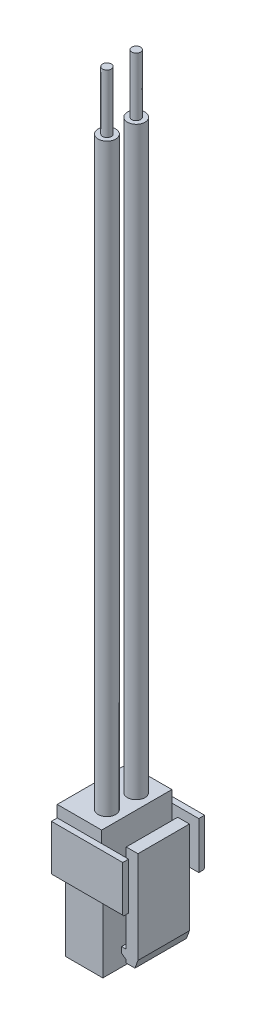
ISO-10303-21;
HEADER;
FILE_DESCRIPTION(('STEP AP214'),'2;1');
FILE_NAME('part.step','',(''),(''),'','','');
FILE_SCHEMA(('AUTOMOTIVE_DESIGN { 1 0 10303 214 1 1 1 1 }'));
ENDSEC;
DATA;
#1=APPLICATION_CONTEXT('core data for automotive mechanical design processes');
#2=APPLICATION_PROTOCOL_DEFINITION('international standard','automotive_design',2000,#1);
#3=PRODUCT_CONTEXT('',#1,'mechanical');
#4=PRODUCT('Part','Part','',(#3));
#5=PRODUCT_RELATED_PRODUCT_CATEGORY('part','',(#4));
#6=PRODUCT_DEFINITION_FORMATION('','',#4);
#7=PRODUCT_DEFINITION_CONTEXT('part definition',#1,'design');
#8=PRODUCT_DEFINITION('design','',#6,#7);
#9=PRODUCT_DEFINITION_SHAPE('','',#8);
#10=(LENGTH_UNIT() NAMED_UNIT(*) SI_UNIT(.MILLI.,.METRE.));
#11=(NAMED_UNIT(*) PLANE_ANGLE_UNIT() SI_UNIT($,.RADIAN.));
#12=(NAMED_UNIT(*) SI_UNIT($,.STERADIAN.) SOLID_ANGLE_UNIT());
#13=UNCERTAINTY_MEASURE_WITH_UNIT(LENGTH_MEASURE(1.E-05),#10,'distance_accuracy_value','');
#14=(GEOMETRIC_REPRESENTATION_CONTEXT(3) GLOBAL_UNCERTAINTY_ASSIGNED_CONTEXT((#13)) GLOBAL_UNIT_ASSIGNED_CONTEXT((#10,
#11,#12)) REPRESENTATION_CONTEXT('',''));
#15=CARTESIAN_POINT('',(0.,0.,0.));
#16=DIRECTION('',(0.,0.,1.));
#17=DIRECTION('',(1.,0.,0.));
#18=AXIS2_PLACEMENT_3D('',#15,#16,#17);
#19=CARTESIAN_POINT('',(1.6,4.,3.));
#20=DIRECTION('',(-1.,0.,0.));
#21=DIRECTION('',(0.,0.,1.));
#22=AXIS2_PLACEMENT_3D('',#19,#20,#21);
#23=PLANE('',#22);
#24=DIRECTION('',(0.,0.,-1.));
#25=VECTOR('',#24,1.);
#26=CARTESIAN_POINT('',(1.6,0.,3.));
#27=LINE('',#26,#25);
#28=CARTESIAN_POINT('',(1.6,0.,3.));
#29=VERTEX_POINT('',#28);
#30=CARTESIAN_POINT('',(1.6,0.,2.9));
#31=VERTEX_POINT('',#30);
#32=EDGE_CURVE('E551',#29,#31,#27,.T.);
#33=ORIENTED_EDGE('',*,*,#32,.T.);
#34=DIRECTION('',(0.,1.,0.));
#35=VECTOR('',#34,1.);
#36=CARTESIAN_POINT('',(1.6,-6.,2.9));
#37=LINE('',#36,#35);
#38=CARTESIAN_POINT('',(1.6,-6.,2.9));
#39=VERTEX_POINT('',#38);
#40=EDGE_CURVE('E558',#39,#31,#37,.T.);
#41=ORIENTED_EDGE('',*,*,#40,.F.);
#42=DIRECTION('',(0.,0.,1.));
#43=VECTOR('',#42,1.);
#44=CARTESIAN_POINT('',(1.6,-6.,-2.9));
#45=LINE('',#44,#43);
#46=CARTESIAN_POINT('',(1.6,-6.,-2.9));
#47=VERTEX_POINT('',#46);
#48=EDGE_CURVE('E267',#47,#39,#45,.T.);
#49=ORIENTED_EDGE('',*,*,#48,.F.);
#50=DIRECTION('',(0.,1.,0.));
#51=VECTOR('',#50,1.);
#52=CARTESIAN_POINT('',(1.6,-6.,-2.9));
#53=LINE('',#52,#51);
#54=CARTESIAN_POINT('',(1.6,0.,-2.9));
#55=VERTEX_POINT('',#54);
#56=EDGE_CURVE('E277',#47,#55,#53,.T.);
#57=ORIENTED_EDGE('',*,*,#56,.T.);
#58=CARTESIAN_POINT('',(1.6,0.,-3.));
#59=VERTEX_POINT('',#58);
#60=EDGE_CURVE('E543',#55,#59,#27,.T.);
#61=ORIENTED_EDGE('',*,*,#60,.T.);
#62=DIRECTION('',(0.,-1.,0.));
#63=VECTOR('',#62,1.);
#64=CARTESIAN_POINT('',(1.6,4.,-3.));
#65=LINE('',#64,#63);
#66=CARTESIAN_POINT('',(1.6,4.,-3.));
#67=VERTEX_POINT('',#66);
#68=EDGE_CURVE('E610',#67,#59,#65,.T.);
#69=ORIENTED_EDGE('',*,*,#68,.F.);
#70=DIRECTION('',(0.,-1.,0.));
#71=VECTOR('',#70,1.);
#72=CARTESIAN_POINT('',(1.6,5.,-3.));
#73=LINE('',#72,#71);
#74=CARTESIAN_POINT('',(1.6,5.,-3.));
#75=VERTEX_POINT('',#74);
#76=EDGE_CURVE('E565',#75,#67,#73,.T.);
#77=ORIENTED_EDGE('',*,*,#76,.F.);
#78=DIRECTION('',(0.,0.,-1.));
#79=VECTOR('',#78,1.);
#80=CARTESIAN_POINT('',(1.6,5.,3.));
#81=LINE('',#80,#79);
#82=CARTESIAN_POINT('',(1.6,5.,3.));
#83=VERTEX_POINT('',#82);
#84=EDGE_CURVE('E563',#83,#75,#81,.T.);
#85=ORIENTED_EDGE('',*,*,#84,.F.);
#86=DIRECTION('',(0.,-1.,0.));
#87=VECTOR('',#86,1.);
#88=CARTESIAN_POINT('',(1.6,5.,3.));
#89=LINE('',#88,#87);
#90=CARTESIAN_POINT('',(1.6,4.,3.));
#91=VERTEX_POINT('',#90);
#92=EDGE_CURVE('E523',#83,#91,#89,.T.);
#93=ORIENTED_EDGE('',*,*,#92,.T.);
#94=DIRECTION('',(0.,-1.,0.));
#95=VECTOR('',#94,1.);
#96=CARTESIAN_POINT('',(1.6,4.,3.));
#97=LINE('',#96,#95);
#98=EDGE_CURVE('E604',#91,#29,#97,.T.);
#99=ORIENTED_EDGE('',*,*,#98,.T.);
#100=EDGE_LOOP('',(#33,#41,#49,#57,#61,#69,#77,#85,#93,#99));
#101=FACE_BOUND('',#100,.T.);
#102=DIRECTION('',(0.,-1.,0.));
#103=VECTOR('',#102,1.);
#104=CARTESIAN_POINT('',(1.6,0.,2.2));
#105=LINE('',#104,#103);
#106=CARTESIAN_POINT('',(1.6,1.,2.2));
#107=VERTEX_POINT('',#106);
#108=CARTESIAN_POINT('',(1.6,0.,2.2));
#109=VERTEX_POINT('',#108);
#110=EDGE_CURVE('E250',#107,#109,#105,.T.);
#111=ORIENTED_EDGE('',*,*,#110,.F.);
#112=DIRECTION('',(0.,0.,-1.));
#113=VECTOR('',#112,1.);
#114=CARTESIAN_POINT('',(1.6,1.,2.2));
#115=LINE('',#114,#113);
#116=CARTESIAN_POINT('',(1.6,1.,-2.2));
#117=VERTEX_POINT('',#116);
#118=EDGE_CURVE('E393',#107,#117,#115,.T.);
#119=ORIENTED_EDGE('',*,*,#118,.T.);
#120=DIRECTION('',(0.,-1.,0.));
#121=VECTOR('',#120,1.);
#122=CARTESIAN_POINT('',(1.6,0.,-2.2));
#123=LINE('',#122,#121);
#124=CARTESIAN_POINT('',(1.6,0.,-2.2));
#125=VERTEX_POINT('',#124);
#126=EDGE_CURVE('E254',#117,#125,#123,.T.);
#127=ORIENTED_EDGE('',*,*,#126,.T.);
#128=DIRECTION('',(0.,0.,-1.));
#129=VECTOR('',#128,1.);
#130=CARTESIAN_POINT('',(1.6,0.,2.2));
#131=LINE('',#130,#129);
#132=EDGE_CURVE('E366',#109,#125,#131,.T.);
#133=ORIENTED_EDGE('',*,*,#132,.F.);
#134=EDGE_LOOP('',(#111,#119,#127,#133));
#135=FACE_BOUND('',#134,.T.);
#136=ADVANCED_FACE('F35',(#101,#135),#23,.F.);
#137=CARTESIAN_POINT('',(-2.2,4.,-3.5));
#138=DIRECTION('',(0.,-1.,0.));
#139=DIRECTION('',(0.,0.,-1.));
#140=AXIS2_PLACEMENT_3D('',#137,#138,#139);
#141=PLANE('',#140);
#142=DIRECTION('',(-1.,0.,0.));
#143=VECTOR('',#142,1.);
#144=CARTESIAN_POINT('',(-2.2,4.,-3.));
#145=LINE('',#144,#143);
#146=CARTESIAN_POINT('',(-2.2,4.,-3.));
#147=VERTEX_POINT('',#146);
#148=EDGE_CURVE('E553',#67,#147,#145,.T.);
#149=ORIENTED_EDGE('',*,*,#148,.F.);
#150=DIRECTION('',(1.,0.,0.));
#151=VECTOR('',#150,1.);
#152=CARTESIAN_POINT('',(3.9,4.,-3.));
#153=LINE('',#152,#151);
#154=CARTESIAN_POINT('',(3.9,4.,-3.));
#155=VERTEX_POINT('',#154);
#156=EDGE_CURVE('E532',#67,#155,#153,.T.);
#157=ORIENTED_EDGE('',*,*,#156,.T.);
#158=DIRECTION('',(0.,0.,-1.));
#159=VECTOR('',#158,1.);
#160=CARTESIAN_POINT('',(3.9,4.,-3.));
#161=LINE('',#160,#159);
#162=CARTESIAN_POINT('',(3.9,4.,-3.5));
#163=VERTEX_POINT('',#162);
#164=EDGE_CURVE('E534',#155,#163,#161,.T.);
#165=ORIENTED_EDGE('',*,*,#164,.T.);
#166=DIRECTION('',(-1.,0.,0.));
#167=VECTOR('',#166,1.);
#168=CARTESIAN_POINT('',(-2.2,4.,-3.5));
#169=LINE('',#168,#167);
#170=CARTESIAN_POINT('',(-2.2,4.,-3.5));
#171=VERTEX_POINT('',#170);
#172=EDGE_CURVE('E536',#163,#171,#169,.T.);
#173=ORIENTED_EDGE('',*,*,#172,.T.);
#174=DIRECTION('',(0.,0.,1.));
#175=VECTOR('',#174,1.);
#176=CARTESIAN_POINT('',(-2.2,4.,3.5));
#177=LINE('',#176,#175);
#178=EDGE_CURVE('E515',#171,#147,#177,.T.);
#179=ORIENTED_EDGE('',*,*,#178,.T.);
#180=EDGE_LOOP('',(#149,#157,#165,#173,#179));
#181=FACE_BOUND('',#180,.T.);
#182=ADVANCED_FACE('F453',(#181),#141,.F.);
#183=DIRECTION('',(1.,0.,0.));
#184=VECTOR('',#183,1.);
#185=CARTESIAN_POINT('',(-2.2,4.,3.));
#186=LINE('',#185,#184);
#187=CARTESIAN_POINT('',(-2.2,4.,3.));
#188=VERTEX_POINT('',#187);
#189=EDGE_CURVE('E557',#188,#91,#186,.T.);
#190=ORIENTED_EDGE('',*,*,#189,.F.);
#191=CARTESIAN_POINT('',(-2.2,4.,3.5));
#192=VERTEX_POINT('',#191);
#193=EDGE_CURVE('E518',#188,#192,#177,.T.);
#194=ORIENTED_EDGE('',*,*,#193,.T.);
#195=DIRECTION('',(1.,0.,0.));
#196=VECTOR('',#195,1.);
#197=CARTESIAN_POINT('',(-2.2,4.,3.5));
#198=LINE('',#197,#196);
#199=CARTESIAN_POINT('',(3.9,4.,3.5));
#200=VERTEX_POINT('',#199);
#201=EDGE_CURVE('E508',#192,#200,#198,.T.);
#202=ORIENTED_EDGE('',*,*,#201,.T.);
#203=DIRECTION('',(0.,0.,-1.));
#204=VECTOR('',#203,1.);
#205=CARTESIAN_POINT('',(3.9,4.,3.5));
#206=LINE('',#205,#204);
#207=CARTESIAN_POINT('',(3.9,4.,3.));
#208=VERTEX_POINT('',#207);
#209=EDGE_CURVE('E527',#200,#208,#206,.T.);
#210=ORIENTED_EDGE('',*,*,#209,.T.);
#211=DIRECTION('',(-1.,0.,0.));
#212=VECTOR('',#211,1.);
#213=CARTESIAN_POINT('',(3.9,4.,3.));
#214=LINE('',#213,#212);
#215=EDGE_CURVE('E529',#208,#91,#214,.T.);
#216=ORIENTED_EDGE('',*,*,#215,.T.);
#217=EDGE_LOOP('',(#190,#194,#202,#210,#216));
#218=FACE_BOUND('',#217,.T.);
#219=ADVANCED_FACE('F459',(#218),#141,.F.);
#220=CARTESIAN_POINT('',(-2.2,4.,3.5));
#221=DIRECTION('',(1.,0.,0.));
#222=DIRECTION('',(0.,0.,-1.));
#223=AXIS2_PLACEMENT_3D('',#220,#221,#222);
#224=PLANE('',#223);
#225=DIRECTION('',(0.,-1.,0.));
#226=VECTOR('',#225,1.);
#227=CARTESIAN_POINT('',(-2.2,4.,-3.5));
#228=LINE('',#227,#226);
#229=CARTESIAN_POINT('',(-2.2,0.0999999999999998,-3.5));
#230=VERTEX_POINT('',#229);
#231=EDGE_CURVE('E504',#171,#230,#228,.T.);
#232=ORIENTED_EDGE('',*,*,#231,.T.);
#233=DIRECTION('',(0.,0.,1.));
#234=VECTOR('',#233,1.);
#235=CARTESIAN_POINT('',(-2.2,0.0999999999999998,3.5));
#236=LINE('',#235,#234);
#237=CARTESIAN_POINT('',(-2.2,0.0999999999999998,3.5));
#238=VERTEX_POINT('',#237);
#239=EDGE_CURVE('E306',#230,#238,#236,.T.);
#240=ORIENTED_EDGE('',*,*,#239,.T.);
#241=DIRECTION('',(0.,-1.,0.));
#242=VECTOR('',#241,1.);
#243=CARTESIAN_POINT('',(-2.2,4.,3.5));
#244=LINE('',#243,#242);
#245=EDGE_CURVE('E298',#192,#238,#244,.T.);
#246=ORIENTED_EDGE('',*,*,#245,.F.);
#247=ORIENTED_EDGE('',*,*,#193,.F.);
#248=DIRECTION('',(0.,-1.,0.));
#249=VECTOR('',#248,1.);
#250=CARTESIAN_POINT('',(-2.2,5.,3.));
#251=LINE('',#250,#249);
#252=CARTESIAN_POINT('',(-2.2,5.,3.));
#253=VERTEX_POINT('',#252);
#254=EDGE_CURVE('E571',#253,#188,#251,.T.);
#255=ORIENTED_EDGE('',*,*,#254,.F.);
#256=DIRECTION('',(0.,0.,1.));
#257=VECTOR('',#256,1.);
#258=CARTESIAN_POINT('',(-2.2,5.,3.));
#259=LINE('',#258,#257);
#260=CARTESIAN_POINT('',(-2.2,5.,-3.));
#261=VERTEX_POINT('',#260);
#262=EDGE_CURVE('E576',#261,#253,#259,.T.);
#263=ORIENTED_EDGE('',*,*,#262,.F.);
#264=DIRECTION('',(0.,-1.,0.));
#265=VECTOR('',#264,1.);
#266=CARTESIAN_POINT('',(-2.2,5.,-3.));
#267=LINE('',#266,#265);
#268=EDGE_CURVE('E541',#261,#147,#267,.T.);
#269=ORIENTED_EDGE('',*,*,#268,.T.);
#270=ORIENTED_EDGE('',*,*,#178,.F.);
#271=EDGE_LOOP('',(#232,#240,#246,#247,#255,#263,#269,#270));
#272=FACE_BOUND('',#271,.T.);
#273=ADVANCED_FACE('F479',(#272),#224,.F.);
#274=CARTESIAN_POINT('',(-2.2,4.,3.5));
#275=DIRECTION('',(0.,0.,-1.));
#276=DIRECTION('',(-1.,0.,0.));
#277=AXIS2_PLACEMENT_3D('',#274,#275,#276);
#278=PLANE('',#277);
#279=ORIENTED_EDGE('',*,*,#245,.T.);
#280=DIRECTION('',(1.,0.,0.));
#281=VECTOR('',#280,1.);
#282=CARTESIAN_POINT('',(3.9,0.0999999999999998,3.5));
#283=LINE('',#282,#281);
#284=CARTESIAN_POINT('',(3.9,0.1,3.5));
#285=VERTEX_POINT('',#284);
#286=EDGE_CURVE('E294',#238,#285,#283,.T.);
#287=ORIENTED_EDGE('',*,*,#286,.T.);
#288=DIRECTION('',(0.,-1.,0.));
#289=VECTOR('',#288,1.);
#290=CARTESIAN_POINT('',(3.9,4.,3.5));
#291=LINE('',#290,#289);
#292=EDGE_CURVE('E509',#200,#285,#291,.T.);
#293=ORIENTED_EDGE('',*,*,#292,.F.);
#294=ORIENTED_EDGE('',*,*,#201,.F.);
#295=EDGE_LOOP('',(#279,#287,#293,#294));
#296=FACE_BOUND('',#295,.T.);
#297=ADVANCED_FACE('F475',(#296),#278,.F.);
#298=CARTESIAN_POINT('',(3.9,4.,3.5));
#299=DIRECTION('',(-1.,0.,0.));
#300=DIRECTION('',(0.,0.,1.));
#301=AXIS2_PLACEMENT_3D('',#298,#299,#300);
#302=PLANE('',#301);
#303=ORIENTED_EDGE('',*,*,#292,.T.);
#304=DIRECTION('',(0.,-0.707106781186546,-0.707106781186549));
#305=VECTOR('',#304,1.);
#306=CARTESIAN_POINT('',(3.9,0.0999999999999998,3.5));
#307=LINE('',#306,#305);
#308=CARTESIAN_POINT('',(3.9,0.,3.4));
#309=VERTEX_POINT('',#308);
#310=EDGE_CURVE('E297',#285,#309,#307,.T.);
#311=ORIENTED_EDGE('',*,*,#310,.T.);
#312=DIRECTION('',(0.,0.,-1.));
#313=VECTOR('',#312,1.);
#314=CARTESIAN_POINT('',(3.9,0.,3.5));
#315=LINE('',#314,#313);
#316=CARTESIAN_POINT('',(3.9,0.,3.));
#317=VERTEX_POINT('',#316);
#318=EDGE_CURVE('E538',#309,#317,#315,.T.);
#319=ORIENTED_EDGE('',*,*,#318,.T.);
#320=DIRECTION('',(0.,-1.,0.));
#321=VECTOR('',#320,1.);
#322=CARTESIAN_POINT('',(3.9,4.,3.));
#323=LINE('',#322,#321);
#324=EDGE_CURVE('E511',#208,#317,#323,.T.);
#325=ORIENTED_EDGE('',*,*,#324,.F.);
#326=ORIENTED_EDGE('',*,*,#209,.F.);
#327=EDGE_LOOP('',(#303,#311,#319,#325,#326));
#328=FACE_BOUND('',#327,.T.);
#329=ADVANCED_FACE('F471',(#328),#302,.F.);
#330=CARTESIAN_POINT('',(3.9,4.,3.));
#331=DIRECTION('',(0.,0.,1.));
#332=DIRECTION('',(1.,0.,0.));
#333=AXIS2_PLACEMENT_3D('',#330,#331,#332);
#334=PLANE('',#333);
#335=DIRECTION('',(-1.,0.,0.));
#336=VECTOR('',#335,1.);
#337=CARTESIAN_POINT('',(3.9,0.,3.));
#338=LINE('',#337,#336);
#339=EDGE_CURVE('E540',#317,#29,#338,.T.);
#340=ORIENTED_EDGE('',*,*,#339,.T.);
#341=ORIENTED_EDGE('',*,*,#98,.F.);
#342=ORIENTED_EDGE('',*,*,#215,.F.);
#343=ORIENTED_EDGE('',*,*,#324,.T.);
#344=EDGE_LOOP('',(#340,#341,#342,#343));
#345=FACE_BOUND('',#344,.T.);
#346=ADVANCED_FACE('F468',(#345),#334,.F.);
#347=CARTESIAN_POINT('',(3.9,4.,-3.));
#348=DIRECTION('',(0.,0.,-1.));
#349=DIRECTION('',(-1.,0.,0.));
#350=AXIS2_PLACEMENT_3D('',#347,#348,#349);
#351=PLANE('',#350);
#352=DIRECTION('',(1.,0.,0.));
#353=VECTOR('',#352,1.);
#354=CARTESIAN_POINT('',(3.9,0.,-3.));
#355=LINE('',#354,#353);
#356=CARTESIAN_POINT('',(3.9,0.,-3.));
#357=VERTEX_POINT('',#356);
#358=EDGE_CURVE('E546',#59,#357,#355,.T.);
#359=ORIENTED_EDGE('',*,*,#358,.T.);
#360=DIRECTION('',(0.,-1.,0.));
#361=VECTOR('',#360,1.);
#362=CARTESIAN_POINT('',(3.9,4.,-3.));
#363=LINE('',#362,#361);
#364=EDGE_CURVE('E615',#155,#357,#363,.T.);
#365=ORIENTED_EDGE('',*,*,#364,.F.);
#366=ORIENTED_EDGE('',*,*,#156,.F.);
#367=ORIENTED_EDGE('',*,*,#68,.T.);
#368=EDGE_LOOP('',(#359,#365,#366,#367));
#369=FACE_BOUND('',#368,.T.);
#370=ADVANCED_FACE('F466',(#369),#351,.F.);
#371=CARTESIAN_POINT('',(3.9,4.,-3.));
#372=DIRECTION('',(-1.,0.,0.));
#373=DIRECTION('',(0.,0.,1.));
#374=AXIS2_PLACEMENT_3D('',#371,#372,#373);
#375=PLANE('',#374);
#376=DIRECTION('',(0.,0.,-1.));
#377=VECTOR('',#376,1.);
#378=CARTESIAN_POINT('',(3.9,0.,-3.));
#379=LINE('',#378,#377);
#380=CARTESIAN_POINT('',(3.9,0.,-3.4));
#381=VERTEX_POINT('',#380);
#382=EDGE_CURVE('E620',#357,#381,#379,.T.);
#383=ORIENTED_EDGE('',*,*,#382,.T.);
#384=DIRECTION('',(0.,0.707106781186546,-0.707106781186549));
#385=VECTOR('',#384,1.);
#386=CARTESIAN_POINT('',(3.9,0.0999999999999998,-3.5));
#387=LINE('',#386,#385);
#388=CARTESIAN_POINT('',(3.9,0.1,-3.5));
#389=VERTEX_POINT('',#388);
#390=EDGE_CURVE('E11',#381,#389,#387,.T.);
#391=ORIENTED_EDGE('',*,*,#390,.T.);
#392=DIRECTION('',(0.,-1.,0.));
#393=VECTOR('',#392,1.);
#394=CARTESIAN_POINT('',(3.9,4.,-3.5));
#395=LINE('',#394,#393);
#396=EDGE_CURVE('E618',#163,#389,#395,.T.);
#397=ORIENTED_EDGE('',*,*,#396,.F.);
#398=ORIENTED_EDGE('',*,*,#164,.F.);
#399=ORIENTED_EDGE('',*,*,#364,.T.);
#400=EDGE_LOOP('',(#383,#391,#397,#398,#399));
#401=FACE_BOUND('',#400,.T.);
#402=ADVANCED_FACE('F628',(#401),#375,.F.);
#403=CARTESIAN_POINT('',(-2.2,4.,-3.5));
#404=DIRECTION('',(0.,0.,1.));
#405=DIRECTION('',(1.,0.,0.));
#406=AXIS2_PLACEMENT_3D('',#403,#404,#405);
#407=PLANE('',#406);
#408=ORIENTED_EDGE('',*,*,#396,.T.);
#409=DIRECTION('',(-1.,0.,0.));
#410=VECTOR('',#409,1.);
#411=CARTESIAN_POINT('',(-2.2,0.0999999999999998,-3.5));
#412=LINE('',#411,#410);
#413=EDGE_CURVE('E44',#389,#230,#412,.T.);
#414=ORIENTED_EDGE('',*,*,#413,.T.);
#415=ORIENTED_EDGE('',*,*,#231,.F.);
#416=ORIENTED_EDGE('',*,*,#172,.F.);
#417=EDGE_LOOP('',(#408,#414,#415,#416));
#418=FACE_BOUND('',#417,.T.);
#419=ADVANCED_FACE('F661',(#418),#407,.F.);
#420=CARTESIAN_POINT('',(-2.2,0.,-3.5));
#421=DIRECTION('',(0.,-1.,0.));
#422=DIRECTION('',(0.,0.,-1.));
#423=AXIS2_PLACEMENT_3D('',#420,#421,#422);
#424=PLANE('',#423);
#425=ORIENTED_EDGE('',*,*,#318,.F.);
#426=DIRECTION('',(-1.,0.,0.));
#427=VECTOR('',#426,1.);
#428=CARTESIAN_POINT('',(-2.2,0.,3.4));
#429=LINE('',#428,#427);
#430=CARTESIAN_POINT('',(-2.1,0.,3.4));
#431=VERTEX_POINT('',#430);
#432=EDGE_CURVE('E304',#309,#431,#429,.T.);
#433=ORIENTED_EDGE('',*,*,#432,.T.);
#434=DIRECTION('',(0.,0.,-1.));
#435=VECTOR('',#434,1.);
#436=CARTESIAN_POINT('',(-2.1,0.,-3.5));
#437=LINE('',#436,#435);
#438=CARTESIAN_POINT('',(-2.1,0.,-3.4));
#439=VERTEX_POINT('',#438);
#440=EDGE_CURVE('E302',#431,#439,#437,.T.);
#441=ORIENTED_EDGE('',*,*,#440,.T.);
#442=DIRECTION('',(1.,0.,0.));
#443=VECTOR('',#442,1.);
#444=CARTESIAN_POINT('',(3.9,0.,-3.4));
#445=LINE('',#444,#443);
#446=EDGE_CURVE('E300',#439,#381,#445,.T.);
#447=ORIENTED_EDGE('',*,*,#446,.T.);
#448=ORIENTED_EDGE('',*,*,#382,.F.);
#449=ORIENTED_EDGE('',*,*,#358,.F.);
#450=ORIENTED_EDGE('',*,*,#60,.F.);
#451=DIRECTION('',(1.,0.,0.));
#452=VECTOR('',#451,1.);
#453=CARTESIAN_POINT('',(1.6,0.,-2.9));
#454=LINE('',#453,#452);
#455=CARTESIAN_POINT('',(-1.6,0.,-2.9));
#456=VERTEX_POINT('',#455);
#457=EDGE_CURVE('E271',#456,#55,#454,.T.);
#458=ORIENTED_EDGE('',*,*,#457,.F.);
#459=DIRECTION('',(0.,0.,-1.));
#460=VECTOR('',#459,1.);
#461=CARTESIAN_POINT('',(-1.6,0.,-2.9));
#462=LINE('',#461,#460);
#463=CARTESIAN_POINT('',(-1.6,0.,2.9));
#464=VERTEX_POINT('',#463);
#465=EDGE_CURVE('E261',#464,#456,#462,.T.);
#466=ORIENTED_EDGE('',*,*,#465,.F.);
#467=DIRECTION('',(-1.,0.,0.));
#468=VECTOR('',#467,1.);
#469=CARTESIAN_POINT('',(1.6,0.,2.9));
#470=LINE('',#469,#468);
#471=EDGE_CURVE('E258',#31,#464,#470,.T.);
#472=ORIENTED_EDGE('',*,*,#471,.F.);
#473=ORIENTED_EDGE('',*,*,#32,.F.);
#474=ORIENTED_EDGE('',*,*,#339,.F.);
#475=EDGE_LOOP('',(#425,#433,#441,#447,#448,#449,#450,#458,#466,#472,#473,#474));
#476=FACE_BOUND('',#475,.T.);
#477=ADVANCED_FACE('F597',(#476),#424,.T.);
#478=CARTESIAN_POINT('',(-2.2,5.,-3.));
#479=DIRECTION('',(0.,0.,1.));
#480=DIRECTION('',(1.,0.,0.));
#481=AXIS2_PLACEMENT_3D('',#478,#479,#480);
#482=PLANE('',#481);
#483=ORIENTED_EDGE('',*,*,#148,.T.);
#484=ORIENTED_EDGE('',*,*,#268,.F.);
#485=DIRECTION('',(-1.,0.,0.));
#486=VECTOR('',#485,1.);
#487=CARTESIAN_POINT('',(-2.2,5.,-3.));
#488=LINE('',#487,#486);
#489=EDGE_CURVE('E579',#75,#261,#488,.T.);
#490=ORIENTED_EDGE('',*,*,#489,.F.);
#491=ORIENTED_EDGE('',*,*,#76,.T.);
#492=EDGE_LOOP('',(#483,#484,#490,#491));
#493=FACE_BOUND('',#492,.T.);
#494=ADVANCED_FACE('F642',(#493),#482,.F.);
#495=CARTESIAN_POINT('',(-2.2,5.,3.));
#496=DIRECTION('',(0.,0.,-1.));
#497=DIRECTION('',(-1.,0.,0.));
#498=AXIS2_PLACEMENT_3D('',#495,#496,#497);
#499=PLANE('',#498);
#500=ORIENTED_EDGE('',*,*,#189,.T.);
#501=ORIENTED_EDGE('',*,*,#92,.F.);
#502=DIRECTION('',(1.,0.,0.));
#503=VECTOR('',#502,1.);
#504=CARTESIAN_POINT('',(-2.2,5.,3.));
#505=LINE('',#504,#503);
#506=EDGE_CURVE('E572',#253,#83,#505,.T.);
#507=ORIENTED_EDGE('',*,*,#506,.F.);
#508=ORIENTED_EDGE('',*,*,#254,.T.);
#509=EDGE_LOOP('',(#500,#501,#507,#508));
#510=FACE_BOUND('',#509,.T.);
#511=ADVANCED_FACE('F634',(#510),#499,.F.);
#512=CARTESIAN_POINT('',(1.6,5.,-3.));
#513=DIRECTION('',(0.,1.,0.));
#514=DIRECTION('',(0.,0.,1.));
#515=AXIS2_PLACEMENT_3D('',#512,#513,#514);
#516=PLANE('',#515);
#517=CARTESIAN_POINT('',(0.299999999999999,5.,-1.25));
#518=DIRECTION('',(0.,1.,0.));
#519=DIRECTION('',(0.,0.,1.));
#520=AXIS2_PLACEMENT_3D('',#517,#518,#519);
#521=CIRCLE('',#520,0.75);
#522=CARTESIAN_POINT('',(0.299999999999999,5.,-0.5));
#523=VERTEX_POINT('',#522);
#524=EDGE_CURVE('E332',#523,#523,#521,.T.);
#525=ORIENTED_EDGE('',*,*,#524,.F.);
#526=EDGE_LOOP('',(#525));
#527=FACE_BOUND('',#526,.T.);
#528=CARTESIAN_POINT('',(0.299999999999999,5.,1.25));
#529=DIRECTION('',(0.,1.,0.));
#530=DIRECTION('',(0.,0.,1.));
#531=AXIS2_PLACEMENT_3D('',#528,#529,#530);
#532=CIRCLE('',#531,0.75);
#533=CARTESIAN_POINT('',(0.299999999999999,5.,2.));
#534=VERTEX_POINT('',#533);
#535=EDGE_CURVE('E338',#534,#534,#532,.T.);
#536=ORIENTED_EDGE('',*,*,#535,.F.);
#537=EDGE_LOOP('',(#536));
#538=FACE_BOUND('',#537,.T.);
#539=ORIENTED_EDGE('',*,*,#489,.T.);
#540=ORIENTED_EDGE('',*,*,#262,.T.);
#541=ORIENTED_EDGE('',*,*,#506,.T.);
#542=ORIENTED_EDGE('',*,*,#84,.T.);
#543=EDGE_LOOP('',(#539,#540,#541,#542));
#544=FACE_BOUND('',#543,.T.);
#545=ADVANCED_FACE('F643',(#527,#538,#544),#516,.T.);
#546=CARTESIAN_POINT('',(1.6,-6.,2.9));
#547=DIRECTION('',(0.,0.,-1.));
#548=DIRECTION('',(-1.,0.,0.));
#549=AXIS2_PLACEMENT_3D('',#546,#547,#548);
#550=PLANE('',#549);
#551=ORIENTED_EDGE('',*,*,#471,.T.);
#552=DIRECTION('',(0.,1.,0.));
#553=VECTOR('',#552,1.);
#554=CARTESIAN_POINT('',(-1.6,-6.,2.9));
#555=LINE('',#554,#553);
#556=CARTESIAN_POINT('',(-1.6,-6.,2.9));
#557=VERTEX_POINT('',#556);
#558=EDGE_CURVE('E582',#557,#464,#555,.T.);
#559=ORIENTED_EDGE('',*,*,#558,.F.);
#560=DIRECTION('',(-1.,0.,0.));
#561=VECTOR('',#560,1.);
#562=CARTESIAN_POINT('',(1.6,-6.,2.9));
#563=LINE('',#562,#561);
#564=EDGE_CURVE('E270',#39,#557,#563,.T.);
#565=ORIENTED_EDGE('',*,*,#564,.F.);
#566=ORIENTED_EDGE('',*,*,#40,.T.);
#567=EDGE_LOOP('',(#551,#559,#565,#566));
#568=FACE_BOUND('',#567,.T.);
#569=ADVANCED_FACE('F600',(#568),#550,.F.);
#570=CARTESIAN_POINT('',(-1.6,-6.,-2.9));
#571=DIRECTION('',(1.,0.,0.));
#572=DIRECTION('',(0.,0.,-1.));
#573=AXIS2_PLACEMENT_3D('',#570,#571,#572);
#574=PLANE('',#573);
#575=ORIENTED_EDGE('',*,*,#465,.T.);
#576=DIRECTION('',(0.,1.,0.));
#577=VECTOR('',#576,1.);
#578=CARTESIAN_POINT('',(-1.6,-6.,-2.9));
#579=LINE('',#578,#577);
#580=CARTESIAN_POINT('',(-1.6,-6.,-2.9));
#581=VERTEX_POINT('',#580);
#582=EDGE_CURVE('E282',#581,#456,#579,.T.);
#583=ORIENTED_EDGE('',*,*,#582,.F.);
#584=DIRECTION('',(0.,0.,-1.));
#585=VECTOR('',#584,1.);
#586=CARTESIAN_POINT('',(-1.6,-6.,-2.9));
#587=LINE('',#586,#585);
#588=EDGE_CURVE('E273',#557,#581,#587,.T.);
#589=ORIENTED_EDGE('',*,*,#588,.F.);
#590=ORIENTED_EDGE('',*,*,#558,.T.);
#591=EDGE_LOOP('',(#575,#583,#589,#590));
#592=FACE_BOUND('',#591,.T.);
#593=ADVANCED_FACE('F594',(#592),#574,.F.);
#594=CARTESIAN_POINT('',(1.6,-6.,-2.9));
#595=DIRECTION('',(0.,0.,1.));
#596=DIRECTION('',(1.,0.,0.));
#597=AXIS2_PLACEMENT_3D('',#594,#595,#596);
#598=PLANE('',#597);
#599=ORIENTED_EDGE('',*,*,#457,.T.);
#600=ORIENTED_EDGE('',*,*,#56,.F.);
#601=DIRECTION('',(1.,0.,0.));
#602=VECTOR('',#601,1.);
#603=CARTESIAN_POINT('',(1.6,-6.,-2.9));
#604=LINE('',#603,#602);
#605=EDGE_CURVE('E275',#581,#47,#604,.T.);
#606=ORIENTED_EDGE('',*,*,#605,.F.);
#607=ORIENTED_EDGE('',*,*,#582,.T.);
#608=EDGE_LOOP('',(#599,#600,#606,#607));
#609=FACE_BOUND('',#608,.T.);
#610=ADVANCED_FACE('F592',(#609),#598,.F.);
#611=CARTESIAN_POINT('',(1.6,-6.,2.9));
#612=DIRECTION('',(0.,-1.,0.));
#613=DIRECTION('',(0.,0.,-1.));
#614=AXIS2_PLACEMENT_3D('',#611,#612,#613);
#615=PLANE('',#614);
#616=ORIENTED_EDGE('',*,*,#48,.T.);
#617=ORIENTED_EDGE('',*,*,#564,.T.);
#618=ORIENTED_EDGE('',*,*,#588,.T.);
#619=ORIENTED_EDGE('',*,*,#605,.T.);
#620=EDGE_LOOP('',(#616,#617,#618,#619));
#621=FACE_BOUND('',#620,.T.);
#622=ADVANCED_FACE('F740',(#621),#615,.T.);
#623=CARTESIAN_POINT('',(2.9,0.,2.2));
#624=DIRECTION('',(0.,1.,0.));
#625=DIRECTION('',(-1.,0.,0.));
#626=AXIS2_PLACEMENT_3D('',#623,#624,#625);
#627=PLANE('',#626);
#628=DIRECTION('',(1.,0.,0.));
#629=VECTOR('',#628,1.);
#630=CARTESIAN_POINT('',(2.9,0.,-2.2));
#631=LINE('',#630,#629);
#632=CARTESIAN_POINT('',(2.9,0.,-2.2));
#633=VERTEX_POINT('',#632);
#634=EDGE_CURVE('E257',#125,#633,#631,.T.);
#635=ORIENTED_EDGE('',*,*,#634,.T.);
#636=DIRECTION('',(0.,0.,-1.));
#637=VECTOR('',#636,1.);
#638=CARTESIAN_POINT('',(2.9,0.,2.2));
#639=LINE('',#638,#637);
#640=CARTESIAN_POINT('',(2.9,0.,2.2));
#641=VERTEX_POINT('',#640);
#642=EDGE_CURVE('E238',#641,#633,#639,.T.);
#643=ORIENTED_EDGE('',*,*,#642,.F.);
#644=DIRECTION('',(1.,0.,0.));
#645=VECTOR('',#644,1.);
#646=CARTESIAN_POINT('',(2.9,0.,2.2));
#647=LINE('',#646,#645);
#648=EDGE_CURVE('E245',#109,#641,#647,.T.);
#649=ORIENTED_EDGE('',*,*,#648,.F.);
#650=ORIENTED_EDGE('',*,*,#132,.T.);
#651=EDGE_LOOP('',(#635,#643,#649,#650));
#652=FACE_BOUND('',#651,.T.);
#653=ADVANCED_FACE('F256',(#652),#627,.F.);
#654=CARTESIAN_POINT('',(2.9,-3.56991698471612,2.2));
#655=DIRECTION('',(1.,0.,0.));
#656=DIRECTION('',(0.,0.,-1.));
#657=AXIS2_PLACEMENT_3D('',#654,#655,#656);
#658=PLANE('',#657);
#659=DIRECTION('',(0.,-1.,0.));
#660=VECTOR('',#659,1.);
#661=CARTESIAN_POINT('',(2.9,-3.56991698471612,-2.2));
#662=LINE('',#661,#660);
#663=CARTESIAN_POINT('',(2.9,-3.56991698471612,-2.2));
#664=VERTEX_POINT('',#663);
#665=EDGE_CURVE('E368',#633,#664,#662,.T.);
#666=ORIENTED_EDGE('',*,*,#665,.T.);
#667=DIRECTION('',(0.,0.,-1.));
#668=VECTOR('',#667,1.);
#669=CARTESIAN_POINT('',(2.9,-3.56991698471612,2.2));
#670=LINE('',#669,#668);
#671=CARTESIAN_POINT('',(2.9,-3.56991698471612,2.2));
#672=VERTEX_POINT('',#671);
#673=EDGE_CURVE('E241',#672,#664,#670,.T.);
#674=ORIENTED_EDGE('',*,*,#673,.F.);
#675=DIRECTION('',(0.,-1.,0.));
#676=VECTOR('',#675,1.);
#677=CARTESIAN_POINT('',(2.9,-3.56991698471612,2.2));
#678=LINE('',#677,#676);
#679=EDGE_CURVE('E234',#641,#672,#678,.T.);
#680=ORIENTED_EDGE('',*,*,#679,.F.);
#681=ORIENTED_EDGE('',*,*,#642,.T.);
#682=EDGE_LOOP('',(#666,#674,#680,#681));
#683=FACE_BOUND('',#682,.T.);
#684=ADVANCED_FACE('F236',(#683),#658,.F.);
#685=CARTESIAN_POINT('',(2.5,-3.56991698471612,2.2));
#686=DIRECTION('',(0.,-1.,0.));
#687=DIRECTION('',(0.,0.,-1.));
#688=AXIS2_PLACEMENT_3D('',#685,#686,#687);
#689=PLANE('',#688);
#690=DIRECTION('',(-1.,0.,0.));
#691=VECTOR('',#690,1.);
#692=CARTESIAN_POINT('',(2.5,-3.56991698471612,-2.2));
#693=LINE('',#692,#691);
#694=CARTESIAN_POINT('',(2.5,-3.56991698471612,-2.2));
#695=VERTEX_POINT('',#694);
#696=EDGE_CURVE('E370',#664,#695,#693,.T.);
#697=ORIENTED_EDGE('',*,*,#696,.T.);
#698=DIRECTION('',(0.,0.,-1.));
#699=VECTOR('',#698,1.);
#700=CARTESIAN_POINT('',(2.5,-3.56991698471612,2.2));
#701=LINE('',#700,#699);
#702=CARTESIAN_POINT('',(2.5,-3.56991698471612,2.2));
#703=VERTEX_POINT('',#702);
#704=EDGE_CURVE('E263',#703,#695,#701,.T.);
#705=ORIENTED_EDGE('',*,*,#704,.F.);
#706=DIRECTION('',(-1.,0.,0.));
#707=VECTOR('',#706,1.);
#708=CARTESIAN_POINT('',(2.5,-3.56991698471612,2.2));
#709=LINE('',#708,#707);
#710=EDGE_CURVE('E244',#672,#703,#709,.T.);
#711=ORIENTED_EDGE('',*,*,#710,.F.);
#712=ORIENTED_EDGE('',*,*,#673,.T.);
#713=EDGE_LOOP('',(#697,#705,#711,#712));
#714=FACE_BOUND('',#713,.T.);
#715=ADVANCED_FACE('F443',(#714),#689,.F.);
#716=CARTESIAN_POINT('',(2.5,-4.06991698471612,2.2));
#717=DIRECTION('',(1.,0.,0.));
#718=DIRECTION('',(0.,1.,0.));
#719=AXIS2_PLACEMENT_3D('',#716,#717,#718);
#720=PLANE('',#719);
#721=DIRECTION('',(0.,-1.,0.));
#722=VECTOR('',#721,1.);
#723=CARTESIAN_POINT('',(2.5,-4.06991698471612,-2.2));
#724=LINE('',#723,#722);
#725=CARTESIAN_POINT('',(2.5,-4.06991698471612,-2.2));
#726=VERTEX_POINT('',#725);
#727=EDGE_CURVE('E372',#695,#726,#724,.T.);
#728=ORIENTED_EDGE('',*,*,#727,.T.);
#729=DIRECTION('',(0.,0.,-1.));
#730=VECTOR('',#729,1.);
#731=CARTESIAN_POINT('',(2.5,-4.06991698471612,2.2));
#732=LINE('',#731,#730);
#733=CARTESIAN_POINT('',(2.5,-4.06991698471612,2.2));
#734=VERTEX_POINT('',#733);
#735=EDGE_CURVE('E417',#734,#726,#732,.T.);
#736=ORIENTED_EDGE('',*,*,#735,.F.);
#737=DIRECTION('',(0.,-1.,0.));
#738=VECTOR('',#737,1.);
#739=CARTESIAN_POINT('',(2.5,-4.06991698471612,2.2));
#740=LINE('',#739,#738);
#741=EDGE_CURVE('E347',#703,#734,#740,.T.);
#742=ORIENTED_EDGE('',*,*,#741,.F.);
#743=ORIENTED_EDGE('',*,*,#704,.T.);
#744=EDGE_LOOP('',(#728,#736,#742,#743));
#745=FACE_BOUND('',#744,.T.);
#746=ADVANCED_FACE('F424',(#745),#720,.F.);
#747=CARTESIAN_POINT('',(2.9,-4.35,2.2));
#748=DIRECTION('',(0.573576436351044,0.819152044288994,0.));
#749=DIRECTION('',(-0.819152044288994,0.573576436351044,0.));
#750=AXIS2_PLACEMENT_3D('',#747,#748,#749);
#751=PLANE('',#750);
#752=DIRECTION('',(0.819152044288994,-0.573576436351044,0.));
#753=VECTOR('',#752,1.);
#754=CARTESIAN_POINT('',(2.9,-4.35,-2.2));
#755=LINE('',#754,#753);
#756=CARTESIAN_POINT('',(2.9,-4.35,-2.2));
#757=VERTEX_POINT('',#756);
#758=EDGE_CURVE('E374',#726,#757,#755,.T.);
#759=ORIENTED_EDGE('',*,*,#758,.T.);
#760=DIRECTION('',(0.,0.,-1.));
#761=VECTOR('',#760,1.);
#762=CARTESIAN_POINT('',(2.9,-4.35,2.2));
#763=LINE('',#762,#761);
#764=CARTESIAN_POINT('',(2.9,-4.35,2.2));
#765=VERTEX_POINT('',#764);
#766=EDGE_CURVE('E414',#765,#757,#763,.T.);
#767=ORIENTED_EDGE('',*,*,#766,.F.);
#768=DIRECTION('',(0.819152044288994,-0.573576436351044,0.));
#769=VECTOR('',#768,1.);
#770=CARTESIAN_POINT('',(2.9,-4.35,2.2));
#771=LINE('',#770,#769);
#772=EDGE_CURVE('E349',#734,#765,#771,.T.);
#773=ORIENTED_EDGE('',*,*,#772,.F.);
#774=ORIENTED_EDGE('',*,*,#735,.T.);
#775=EDGE_LOOP('',(#759,#767,#773,#774));
#776=FACE_BOUND('',#775,.T.);
#777=ADVANCED_FACE('F435',(#776),#751,.F.);
#778=CARTESIAN_POINT('',(2.9,-4.6,2.2));
#779=DIRECTION('',(1.,0.,0.));
#780=DIRECTION('',(0.,0.,-1.));
#781=AXIS2_PLACEMENT_3D('',#778,#779,#780);
#782=PLANE('',#781);
#783=DIRECTION('',(0.,-1.,0.));
#784=VECTOR('',#783,1.);
#785=CARTESIAN_POINT('',(2.9,-4.6,-2.2));
#786=LINE('',#785,#784);
#787=CARTESIAN_POINT('',(2.9,-4.6,-2.2));
#788=VERTEX_POINT('',#787);
#789=EDGE_CURVE('E376',#757,#788,#786,.T.);
#790=ORIENTED_EDGE('',*,*,#789,.T.);
#791=DIRECTION('',(0.,0.,-1.));
#792=VECTOR('',#791,1.);
#793=CARTESIAN_POINT('',(2.9,-4.6,2.2));
#794=LINE('',#793,#792);
#795=CARTESIAN_POINT('',(2.9,-4.6,2.2));
#796=VERTEX_POINT('',#795);
#797=EDGE_CURVE('E411',#796,#788,#794,.T.);
#798=ORIENTED_EDGE('',*,*,#797,.F.);
#799=DIRECTION('',(0.,-1.,0.));
#800=VECTOR('',#799,1.);
#801=CARTESIAN_POINT('',(2.9,-4.6,2.2));
#802=LINE('',#801,#800);
#803=EDGE_CURVE('E351',#765,#796,#802,.T.);
#804=ORIENTED_EDGE('',*,*,#803,.F.);
#805=ORIENTED_EDGE('',*,*,#766,.T.);
#806=EDGE_LOOP('',(#790,#798,#804,#805));
#807=FACE_BOUND('',#806,.T.);
#808=ADVANCED_FACE('F439',(#807),#782,.F.);
#809=CARTESIAN_POINT('',(3.64522083601366,-4.6,2.2));
#810=DIRECTION('',(0.,1.,0.));
#811=DIRECTION('',(-1.,0.,0.));
#812=AXIS2_PLACEMENT_3D('',#809,#810,#811);
#813=PLANE('',#812);
#814=DIRECTION('',(1.,0.,0.));
#815=VECTOR('',#814,1.);
#816=CARTESIAN_POINT('',(3.64522083601366,-4.6,-2.2));
#817=LINE('',#816,#815);
#818=CARTESIAN_POINT('',(3.64522083601366,-4.6,-2.2));
#819=VERTEX_POINT('',#818);
#820=EDGE_CURVE('E378',#788,#819,#817,.T.);
#821=ORIENTED_EDGE('',*,*,#820,.T.);
#822=DIRECTION('',(0.,0.,-1.));
#823=VECTOR('',#822,1.);
#824=CARTESIAN_POINT('',(3.64522083601366,-4.6,2.2));
#825=LINE('',#824,#823);
#826=CARTESIAN_POINT('',(3.64522083601366,-4.6,2.2));
#827=VERTEX_POINT('',#826);
#828=EDGE_CURVE('E408',#827,#819,#825,.T.);
#829=ORIENTED_EDGE('',*,*,#828,.F.);
#830=DIRECTION('',(1.,0.,0.));
#831=VECTOR('',#830,1.);
#832=CARTESIAN_POINT('',(3.64522083601366,-4.6,2.2));
#833=LINE('',#832,#831);
#834=EDGE_CURVE('E353',#796,#827,#833,.T.);
#835=ORIENTED_EDGE('',*,*,#834,.F.);
#836=ORIENTED_EDGE('',*,*,#797,.T.);
#837=EDGE_LOOP('',(#821,#829,#835,#836));
#838=FACE_BOUND('',#837,.T.);
#839=ADVANCED_FACE('F794',(#838),#813,.F.);
#840=CARTESIAN_POINT('',(3.9,-3.9,2.2));
#841=DIRECTION('',(-0.939692620785908,0.34202014332567,0.));
#842=DIRECTION('',(-0.34202014332567,-0.939692620785908,0.));
#843=AXIS2_PLACEMENT_3D('',#840,#841,#842);
#844=PLANE('',#843);
#845=DIRECTION('',(0.34202014332567,0.939692620785908,0.));
#846=VECTOR('',#845,1.);
#847=CARTESIAN_POINT('',(3.9,-3.9,-2.2));
#848=LINE('',#847,#846);
#849=CARTESIAN_POINT('',(3.9,-3.9,-2.2));
#850=VERTEX_POINT('',#849);
#851=EDGE_CURVE('E380',#819,#850,#848,.T.);
#852=ORIENTED_EDGE('',*,*,#851,.T.);
#853=DIRECTION('',(0.,0.,-1.));
#854=VECTOR('',#853,1.);
#855=CARTESIAN_POINT('',(3.9,-3.9,2.2));
#856=LINE('',#855,#854);
#857=CARTESIAN_POINT('',(3.9,-3.9,2.2));
#858=VERTEX_POINT('',#857);
#859=EDGE_CURVE('E405',#858,#850,#856,.T.);
#860=ORIENTED_EDGE('',*,*,#859,.F.);
#861=DIRECTION('',(0.34202014332567,0.939692620785908,0.));
#862=VECTOR('',#861,1.);
#863=CARTESIAN_POINT('',(3.9,-3.9,2.2));
#864=LINE('',#863,#862);
#865=EDGE_CURVE('E355',#827,#858,#864,.T.);
#866=ORIENTED_EDGE('',*,*,#865,.F.);
#867=ORIENTED_EDGE('',*,*,#828,.T.);
#868=EDGE_LOOP('',(#852,#860,#866,#867));
#869=FACE_BOUND('',#868,.T.);
#870=ADVANCED_FACE('F802',(#869),#844,.F.);
#871=CARTESIAN_POINT('',(3.9,4.,2.2));
#872=DIRECTION('',(-1.,0.,0.));
#873=DIRECTION('',(0.,-1.,0.));
#874=AXIS2_PLACEMENT_3D('',#871,#872,#873);
#875=PLANE('',#874);
#876=DIRECTION('',(0.,1.,0.));
#877=VECTOR('',#876,1.);
#878=CARTESIAN_POINT('',(3.9,4.,-2.2));
#879=LINE('',#878,#877);
#880=CARTESIAN_POINT('',(3.9,4.,-2.2));
#881=VERTEX_POINT('',#880);
#882=EDGE_CURVE('E382',#850,#881,#879,.T.);
#883=ORIENTED_EDGE('',*,*,#882,.T.);
#884=DIRECTION('',(0.,0.,-1.));
#885=VECTOR('',#884,1.);
#886=CARTESIAN_POINT('',(3.9,4.,2.2));
#887=LINE('',#886,#885);
#888=CARTESIAN_POINT('',(3.9,4.,2.2));
#889=VERTEX_POINT('',#888);
#890=EDGE_CURVE('E402',#889,#881,#887,.T.);
#891=ORIENTED_EDGE('',*,*,#890,.F.);
#892=DIRECTION('',(0.,1.,0.));
#893=VECTOR('',#892,1.);
#894=CARTESIAN_POINT('',(3.9,4.,2.2));
#895=LINE('',#894,#893);
#896=EDGE_CURVE('E357',#858,#889,#895,.T.);
#897=ORIENTED_EDGE('',*,*,#896,.F.);
#898=ORIENTED_EDGE('',*,*,#859,.T.);
#899=EDGE_LOOP('',(#883,#891,#897,#898));
#900=FACE_BOUND('',#899,.T.);
#901=ADVANCED_FACE('F811',(#900),#875,.F.);
#902=CARTESIAN_POINT('',(3.9,4.,2.2));
#903=DIRECTION('',(0.,-1.,0.));
#904=DIRECTION('',(0.,0.,-1.));
#905=AXIS2_PLACEMENT_3D('',#902,#903,#904);
#906=PLANE('',#905);
#907=DIRECTION('',(-1.,0.,0.));
#908=VECTOR('',#907,1.);
#909=CARTESIAN_POINT('',(3.9,4.,-2.2));
#910=LINE('',#909,#908);
#911=CARTESIAN_POINT('',(2.9,4.,-2.2));
#912=VERTEX_POINT('',#911);
#913=EDGE_CURVE('E384',#881,#912,#910,.T.);
#914=ORIENTED_EDGE('',*,*,#913,.T.);
#915=DIRECTION('',(0.,0.,-1.));
#916=VECTOR('',#915,1.);
#917=CARTESIAN_POINT('',(2.9,4.,2.2));
#918=LINE('',#917,#916);
#919=CARTESIAN_POINT('',(2.9,4.,2.2));
#920=VERTEX_POINT('',#919);
#921=EDGE_CURVE('E399',#920,#912,#918,.T.);
#922=ORIENTED_EDGE('',*,*,#921,.F.);
#923=DIRECTION('',(-1.,0.,0.));
#924=VECTOR('',#923,1.);
#925=CARTESIAN_POINT('',(3.9,4.,2.2));
#926=LINE('',#925,#924);
#927=EDGE_CURVE('E359',#889,#920,#926,.T.);
#928=ORIENTED_EDGE('',*,*,#927,.F.);
#929=ORIENTED_EDGE('',*,*,#890,.T.);
#930=EDGE_LOOP('',(#914,#922,#928,#929));
#931=FACE_BOUND('',#930,.T.);
#932=ADVANCED_FACE('F820',(#931),#906,.F.);
#933=CARTESIAN_POINT('',(2.9,4.,2.2));
#934=DIRECTION('',(1.,0.,0.));
#935=DIRECTION('',(0.,1.,0.));
#936=AXIS2_PLACEMENT_3D('',#933,#934,#935);
#937=PLANE('',#936);
#938=DIRECTION('',(0.,-1.,0.));
#939=VECTOR('',#938,1.);
#940=CARTESIAN_POINT('',(2.9,4.,-2.2));
#941=LINE('',#940,#939);
#942=CARTESIAN_POINT('',(2.9,1.,-2.2));
#943=VERTEX_POINT('',#942);
#944=EDGE_CURVE('E386',#912,#943,#941,.T.);
#945=ORIENTED_EDGE('',*,*,#944,.T.);
#946=DIRECTION('',(0.,0.,-1.));
#947=VECTOR('',#946,1.);
#948=CARTESIAN_POINT('',(2.9,1.,2.2));
#949=LINE('',#948,#947);
#950=CARTESIAN_POINT('',(2.9,1.,2.2));
#951=VERTEX_POINT('',#950);
#952=EDGE_CURVE('E396',#951,#943,#949,.T.);
#953=ORIENTED_EDGE('',*,*,#952,.F.);
#954=DIRECTION('',(0.,-1.,0.));
#955=VECTOR('',#954,1.);
#956=CARTESIAN_POINT('',(2.9,4.,2.2));
#957=LINE('',#956,#955);
#958=EDGE_CURVE('E361',#920,#951,#957,.T.);
#959=ORIENTED_EDGE('',*,*,#958,.F.);
#960=ORIENTED_EDGE('',*,*,#921,.T.);
#961=EDGE_LOOP('',(#945,#953,#959,#960));
#962=FACE_BOUND('',#961,.T.);
#963=ADVANCED_FACE('F829',(#962),#937,.F.);
#964=CARTESIAN_POINT('',(2.9,1.,2.2));
#965=DIRECTION('',(0.,-1.,0.));
#966=DIRECTION('',(1.,0.,0.));
#967=AXIS2_PLACEMENT_3D('',#964,#965,#966);
#968=PLANE('',#967);
#969=DIRECTION('',(-1.,0.,0.));
#970=VECTOR('',#969,1.);
#971=CARTESIAN_POINT('',(2.9,1.,-2.2));
#972=LINE('',#971,#970);
#973=EDGE_CURVE('E388',#943,#117,#972,.T.);
#974=ORIENTED_EDGE('',*,*,#973,.T.);
#975=ORIENTED_EDGE('',*,*,#118,.F.);
#976=DIRECTION('',(-1.,0.,0.));
#977=VECTOR('',#976,1.);
#978=CARTESIAN_POINT('',(2.9,1.,2.2));
#979=LINE('',#978,#977);
#980=EDGE_CURVE('E363',#951,#107,#979,.T.);
#981=ORIENTED_EDGE('',*,*,#980,.F.);
#982=ORIENTED_EDGE('',*,*,#952,.T.);
#983=EDGE_LOOP('',(#974,#975,#981,#982));
#984=FACE_BOUND('',#983,.T.);
#985=ADVANCED_FACE('F838',(#984),#968,.F.);
#986=CARTESIAN_POINT('',(1.6,0.,2.2));
#987=DIRECTION('',(0.,0.,-1.));
#988=DIRECTION('',(-1.,0.,0.));
#989=AXIS2_PLACEMENT_3D('',#986,#987,#988);
#990=PLANE('',#989);
#991=ORIENTED_EDGE('',*,*,#648,.T.);
#992=ORIENTED_EDGE('',*,*,#679,.T.);
#993=ORIENTED_EDGE('',*,*,#710,.T.);
#994=ORIENTED_EDGE('',*,*,#741,.T.);
#995=ORIENTED_EDGE('',*,*,#772,.T.);
#996=ORIENTED_EDGE('',*,*,#803,.T.);
#997=ORIENTED_EDGE('',*,*,#834,.T.);
#998=ORIENTED_EDGE('',*,*,#865,.T.);
#999=ORIENTED_EDGE('',*,*,#896,.T.);
#1000=ORIENTED_EDGE('',*,*,#927,.T.);
#1001=ORIENTED_EDGE('',*,*,#958,.T.);
#1002=ORIENTED_EDGE('',*,*,#980,.T.);
#1003=ORIENTED_EDGE('',*,*,#110,.T.);
#1004=EDGE_LOOP('',(#991,#992,#993,#994,#995,#996,#997,#998,#999,#1000,#1001,#1002,#1003));
#1005=FACE_BOUND('',#1004,.T.);
#1006=ADVANCED_FACE('F248',(#1005),#990,.F.);
#1007=CARTESIAN_POINT('',(1.6,0.,-2.2));
#1008=DIRECTION('',(0.,0.,-1.));
#1009=DIRECTION('',(-1.,0.,0.));
#1010=AXIS2_PLACEMENT_3D('',#1007,#1008,#1009);
#1011=PLANE('',#1010);
#1012=ORIENTED_EDGE('',*,*,#634,.F.);
#1013=ORIENTED_EDGE('',*,*,#126,.F.);
#1014=ORIENTED_EDGE('',*,*,#973,.F.);
#1015=ORIENTED_EDGE('',*,*,#944,.F.);
#1016=ORIENTED_EDGE('',*,*,#913,.F.);
#1017=ORIENTED_EDGE('',*,*,#882,.F.);
#1018=ORIENTED_EDGE('',*,*,#851,.F.);
#1019=ORIENTED_EDGE('',*,*,#820,.F.);
#1020=ORIENTED_EDGE('',*,*,#789,.F.);
#1021=ORIENTED_EDGE('',*,*,#758,.F.);
#1022=ORIENTED_EDGE('',*,*,#727,.F.);
#1023=ORIENTED_EDGE('',*,*,#696,.F.);
#1024=ORIENTED_EDGE('',*,*,#665,.F.);
#1025=EDGE_LOOP('',(#1012,#1013,#1014,#1015,#1016,#1017,#1018,#1019,#1020,#1021,#1022,#1023,#1024));
#1026=FACE_BOUND('',#1025,.T.);
#1027=ADVANCED_FACE('F430',(#1026),#1011,.T.);
#1028=CARTESIAN_POINT('',(0.299999999999999,55.,1.25));
#1029=DIRECTION('',(0.,-1.,0.));
#1030=DIRECTION('',(0.,0.,-1.));
#1031=AXIS2_PLACEMENT_3D('',#1028,#1029,#1030);
#1032=CYLINDRICAL_SURFACE('',#1031,0.75);
#1033=CARTESIAN_POINT('',(0.299999999999999,55.,1.25));
#1034=DIRECTION('',(0.,1.,0.));
#1035=DIRECTION('',(0.,0.,1.));
#1036=AXIS2_PLACEMENT_3D('',#1033,#1034,#1035);
#1037=CIRCLE('',#1036,0.75);
#1038=CARTESIAN_POINT('',(0.299999999999999,55.,2.));
#1039=VERTEX_POINT('',#1038);
#1040=EDGE_CURVE('E341',#1039,#1039,#1037,.T.);
#1041=ORIENTED_EDGE('',*,*,#1040,.F.);
#1042=EDGE_LOOP('',(#1041));
#1043=FACE_BOUND('',#1042,.T.);
#1044=ORIENTED_EDGE('',*,*,#535,.T.);
#1045=EDGE_LOOP('',(#1044));
#1046=FACE_BOUND('',#1045,.T.);
#1047=ADVANCED_FACE('F861',(#1043,#1046),#1032,.T.);
#1048=CARTESIAN_POINT('',(0.299999999999999,55.,1.25));
#1049=DIRECTION('',(0.,1.,0.));
#1050=DIRECTION('',(0.,0.,1.));
#1051=AXIS2_PLACEMENT_3D('',#1048,#1049,#1050);
#1052=PLANE('',#1051);
#1053=CARTESIAN_POINT('',(0.299999999999999,55.,1.25));
#1054=DIRECTION('',(0.,1.,0.));
#1055=DIRECTION('',(0.,0.,1.));
#1056=AXIS2_PLACEMENT_3D('',#1053,#1054,#1055);
#1057=CIRCLE('',#1056,0.375);
#1058=CARTESIAN_POINT('',(0.299999999999999,55.,1.625));
#1059=VERTEX_POINT('',#1058);
#1060=EDGE_CURVE('E315',#1059,#1059,#1057,.T.);
#1061=ORIENTED_EDGE('',*,*,#1060,.F.);
#1062=EDGE_LOOP('',(#1061));
#1063=FACE_BOUND('',#1062,.T.);
#1064=ORIENTED_EDGE('',*,*,#1040,.T.);
#1065=EDGE_LOOP('',(#1064));
#1066=FACE_BOUND('',#1065,.T.);
#1067=ADVANCED_FACE('F868',(#1063,#1066),#1052,.T.);
#1068=CARTESIAN_POINT('',(0.299999999999999,55.,-1.25));
#1069=DIRECTION('',(0.,-1.,0.));
#1070=DIRECTION('',(0.,0.,-1.));
#1071=AXIS2_PLACEMENT_3D('',#1068,#1069,#1070);
#1072=CYLINDRICAL_SURFACE('',#1071,0.75);
#1073=CARTESIAN_POINT('',(0.299999999999999,55.,-1.25));
#1074=DIRECTION('',(0.,1.,0.));
#1075=DIRECTION('',(0.,0.,1.));
#1076=AXIS2_PLACEMENT_3D('',#1073,#1074,#1075);
#1077=CIRCLE('',#1076,0.75);
#1078=CARTESIAN_POINT('',(0.299999999999999,55.,-0.5));
#1079=VERTEX_POINT('',#1078);
#1080=EDGE_CURVE('E335',#1079,#1079,#1077,.T.);
#1081=ORIENTED_EDGE('',*,*,#1080,.F.);
#1082=EDGE_LOOP('',(#1081));
#1083=FACE_BOUND('',#1082,.T.);
#1084=ORIENTED_EDGE('',*,*,#524,.T.);
#1085=EDGE_LOOP('',(#1084));
#1086=FACE_BOUND('',#1085,.T.);
#1087=ADVANCED_FACE('F879',(#1083,#1086),#1072,.T.);
#1088=CARTESIAN_POINT('',(0.299999999999999,55.,-1.25));
#1089=DIRECTION('',(0.,1.,0.));
#1090=DIRECTION('',(0.,0.,1.));
#1091=AXIS2_PLACEMENT_3D('',#1088,#1089,#1090);
#1092=PLANE('',#1091);
#1093=CARTESIAN_POINT('',(0.299999999999999,55.,-1.25));
#1094=DIRECTION('',(0.,1.,0.));
#1095=DIRECTION('',(0.,0.,1.));
#1096=AXIS2_PLACEMENT_3D('',#1093,#1094,#1095);
#1097=CIRCLE('',#1096,0.375);
#1098=CARTESIAN_POINT('',(0.299999999999999,55.,-0.875));
#1099=VERTEX_POINT('',#1098);
#1100=EDGE_CURVE('E326',#1099,#1099,#1097,.T.);
#1101=ORIENTED_EDGE('',*,*,#1100,.F.);
#1102=EDGE_LOOP('',(#1101));
#1103=FACE_BOUND('',#1102,.T.);
#1104=ORIENTED_EDGE('',*,*,#1080,.T.);
#1105=EDGE_LOOP('',(#1104));
#1106=FACE_BOUND('',#1105,.T.);
#1107=ADVANCED_FACE('F889',(#1103,#1106),#1092,.T.);
#1108=CARTESIAN_POINT('',(0.299999999999999,60.,-1.25));
#1109=DIRECTION('',(0.,-1.,0.));
#1110=DIRECTION('',(0.,0.,-1.));
#1111=AXIS2_PLACEMENT_3D('',#1108,#1109,#1110);
#1112=CYLINDRICAL_SURFACE('',#1111,0.375);
#1113=CARTESIAN_POINT('',(0.299999999999999,60.,-1.25));
#1114=DIRECTION('',(0.,1.,0.));
#1115=DIRECTION('',(0.,0.,1.));
#1116=AXIS2_PLACEMENT_3D('',#1113,#1114,#1115);
#1117=CIRCLE('',#1116,0.375);
#1118=CARTESIAN_POINT('',(0.299999999999999,60.,-0.875));
#1119=VERTEX_POINT('',#1118);
#1120=EDGE_CURVE('E329',#1119,#1119,#1117,.T.);
#1121=ORIENTED_EDGE('',*,*,#1120,.F.);
#1122=EDGE_LOOP('',(#1121));
#1123=FACE_BOUND('',#1122,.T.);
#1124=ORIENTED_EDGE('',*,*,#1100,.T.);
#1125=EDGE_LOOP('',(#1124));
#1126=FACE_BOUND('',#1125,.T.);
#1127=ADVANCED_FACE('F898',(#1123,#1126),#1112,.T.);
#1128=CARTESIAN_POINT('',(0.299999999999999,60.,-1.25));
#1129=DIRECTION('',(0.,1.,0.));
#1130=DIRECTION('',(0.,0.,1.));
#1131=AXIS2_PLACEMENT_3D('',#1128,#1129,#1130);
#1132=PLANE('',#1131);
#1133=ORIENTED_EDGE('',*,*,#1120,.T.);
#1134=EDGE_LOOP('',(#1133));
#1135=FACE_BOUND('',#1134,.T.);
#1136=ADVANCED_FACE('F908',(#1135),#1132,.T.);
#1137=CARTESIAN_POINT('',(0.299999999999999,60.,1.25));
#1138=DIRECTION('',(0.,-1.,0.));
#1139=DIRECTION('',(0.,0.,-1.));
#1140=AXIS2_PLACEMENT_3D('',#1137,#1138,#1139);
#1141=CYLINDRICAL_SURFACE('',#1140,0.375);
#1142=CARTESIAN_POINT('',(0.299999999999999,60.,1.25));
#1143=DIRECTION('',(0.,1.,0.));
#1144=DIRECTION('',(0.,0.,1.));
#1145=AXIS2_PLACEMENT_3D('',#1142,#1143,#1144);
#1146=CIRCLE('',#1145,0.375);
#1147=CARTESIAN_POINT('',(0.299999999999999,60.,1.625));
#1148=VERTEX_POINT('',#1147);
#1149=EDGE_CURVE('E321',#1148,#1148,#1146,.T.);
#1150=ORIENTED_EDGE('',*,*,#1149,.F.);
#1151=EDGE_LOOP('',(#1150));
#1152=FACE_BOUND('',#1151,.T.);
#1153=ORIENTED_EDGE('',*,*,#1060,.T.);
#1154=EDGE_LOOP('',(#1153));
#1155=FACE_BOUND('',#1154,.T.);
#1156=ADVANCED_FACE('F496',(#1152,#1155),#1141,.T.);
#1157=CARTESIAN_POINT('',(0.299999999999999,60.,1.25));
#1158=DIRECTION('',(0.,1.,0.));
#1159=DIRECTION('',(0.,0.,1.));
#1160=AXIS2_PLACEMENT_3D('',#1157,#1158,#1159);
#1161=PLANE('',#1160);
#1162=ORIENTED_EDGE('',*,*,#1149,.T.);
#1163=EDGE_LOOP('',(#1162));
#1164=FACE_BOUND('',#1163,.T.);
#1165=ADVANCED_FACE('F491',(#1164),#1161,.T.);
#1166=CARTESIAN_POINT('',(-2.2,0.0999999999999998,-3.5));
#1167=DIRECTION('',(0.,-0.707106781186549,-0.707106781186546));
#1168=DIRECTION('',(0.,0.707106781186546,-0.707106781186549));
#1169=AXIS2_PLACEMENT_3D('',#1166,#1167,#1168);
#1170=PLANE('',#1169);
#1171=ORIENTED_EDGE('',*,*,#390,.F.);
#1172=ORIENTED_EDGE('',*,*,#446,.F.);
#1173=DIRECTION('',(-0.577350269189627,0.577350269189624,-0.577350269189627));
#1174=VECTOR('',#1173,1.);
#1175=CARTESIAN_POINT('',(-2.2,0.0999999999999998,-3.5));
#1176=LINE('',#1175,#1174);
#1177=EDGE_CURVE('E39',#230,#439,#1176,.F.);
#1178=ORIENTED_EDGE('',*,*,#1177,.F.);
#1179=ORIENTED_EDGE('',*,*,#413,.F.);
#1180=EDGE_LOOP('',(#1171,#1172,#1178,#1179));
#1181=FACE_BOUND('',#1180,.T.);
#1182=ADVANCED_FACE('F37',(#1181),#1170,.T.);
#1183=CARTESIAN_POINT('',(-2.2,0.0999999999999998,3.5));
#1184=DIRECTION('',(-0.707106781186546,-0.707106781186549,0.));
#1185=DIRECTION('',(0.707106781186549,-0.707106781186546,0.));
#1186=AXIS2_PLACEMENT_3D('',#1183,#1184,#1185);
#1187=PLANE('',#1186);
#1188=ORIENTED_EDGE('',*,*,#1177,.T.);
#1189=ORIENTED_EDGE('',*,*,#440,.F.);
#1190=DIRECTION('',(-0.577350269189627,0.577350269189624,0.577350269189627));
#1191=VECTOR('',#1190,1.);
#1192=CARTESIAN_POINT('',(-2.2,0.0999999999999998,3.5));
#1193=LINE('',#1192,#1191);
#1194=EDGE_CURVE('E308',#238,#431,#1193,.F.);
#1195=ORIENTED_EDGE('',*,*,#1194,.F.);
#1196=ORIENTED_EDGE('',*,*,#239,.F.);
#1197=EDGE_LOOP('',(#1188,#1189,#1195,#1196));
#1198=FACE_BOUND('',#1197,.T.);
#1199=ADVANCED_FACE('F486',(#1198),#1187,.T.);
#1200=CARTESIAN_POINT('',(-2.2,0.0999999999999998,3.5));
#1201=DIRECTION('',(0.,-0.707106781186549,0.707106781186546));
#1202=DIRECTION('',(0.,-0.707106781186546,-0.707106781186549));
#1203=AXIS2_PLACEMENT_3D('',#1200,#1201,#1202);
#1204=PLANE('',#1203);
#1205=ORIENTED_EDGE('',*,*,#1194,.T.);
#1206=ORIENTED_EDGE('',*,*,#432,.F.);
#1207=ORIENTED_EDGE('',*,*,#310,.F.);
#1208=ORIENTED_EDGE('',*,*,#286,.F.);
#1209=EDGE_LOOP('',(#1205,#1206,#1207,#1208));
#1210=FACE_BOUND('',#1209,.T.);
#1211=ADVANCED_FACE('F484',(#1210),#1204,.T.);
#1212=CLOSED_SHELL('',(#136,#182,#219,#273,#297,#329,#346,#370,#402,#419,#477,#494,#511,#545,
#569,#593,#610,#622,#653,#684,#715,#746,#777,#808,#839,#870,#901,#932,#963,#985,#1006,#1027,
#1047,#1067,#1087,#1107,#1127,#1136,#1156,#1165,#1182,#1199,#1211));
#1213=MANIFOLD_SOLID_BREP('B2',#1212);
#1214=ADVANCED_BREP_SHAPE_REPRESENTATION('',(#18,#1213),#14);
#1215=SHAPE_DEFINITION_REPRESENTATION(#9,#1214);
ENDSEC;
END-ISO-10303-21;
